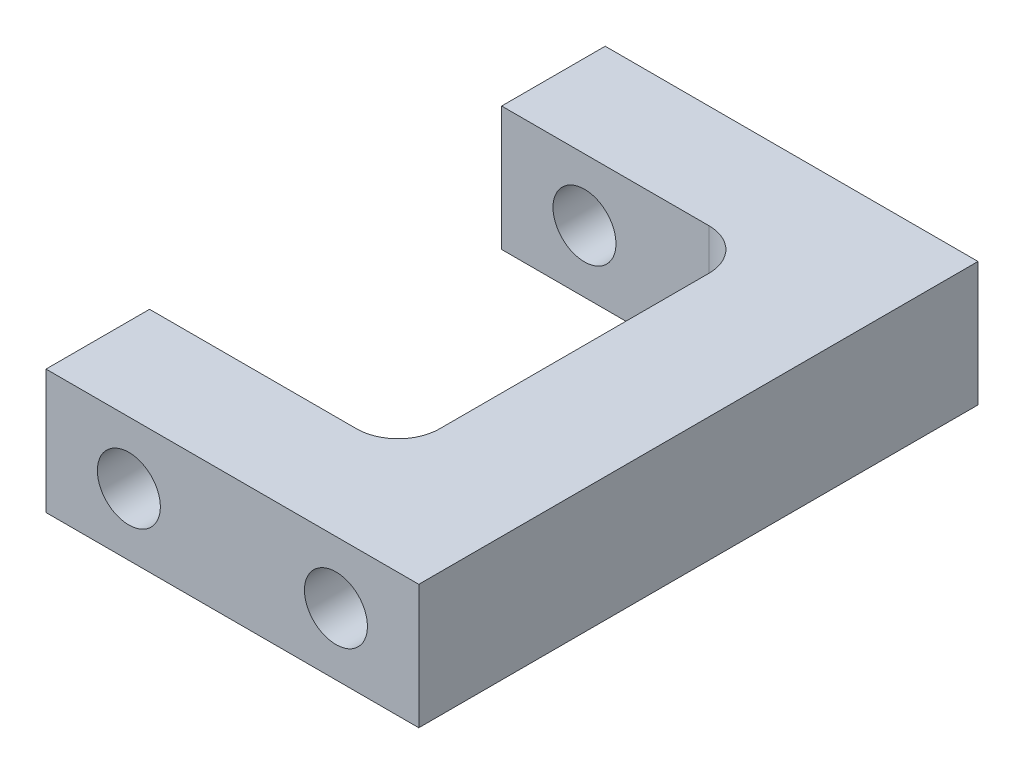
ISO-10303-21;
HEADER;
FILE_DESCRIPTION(('STEP AP214'),'2;1');
FILE_NAME('part.step','',(''),(''),'','','');
FILE_SCHEMA(('AUTOMOTIVE_DESIGN { 1 0 10303 214 1 1 1 1 }'));
ENDSEC;
DATA;
#1=APPLICATION_CONTEXT('core data for automotive mechanical design processes');
#2=APPLICATION_PROTOCOL_DEFINITION('international standard','automotive_design',2000,#1);
#3=PRODUCT_CONTEXT('',#1,'mechanical');
#4=PRODUCT('Part','Part','',(#3));
#5=PRODUCT_RELATED_PRODUCT_CATEGORY('part','',(#4));
#6=PRODUCT_DEFINITION_FORMATION('','',#4);
#7=PRODUCT_DEFINITION_CONTEXT('part definition',#1,'design');
#8=PRODUCT_DEFINITION('design','',#6,#7);
#9=PRODUCT_DEFINITION_SHAPE('','',#8);
#10=(LENGTH_UNIT() NAMED_UNIT(*) SI_UNIT(.MILLI.,.METRE.));
#11=(NAMED_UNIT(*) PLANE_ANGLE_UNIT() SI_UNIT($,.RADIAN.));
#12=(NAMED_UNIT(*) SI_UNIT($,.STERADIAN.) SOLID_ANGLE_UNIT());
#13=UNCERTAINTY_MEASURE_WITH_UNIT(LENGTH_MEASURE(1.E-05),#10,'distance_accuracy_value','');
#14=(GEOMETRIC_REPRESENTATION_CONTEXT(3) GLOBAL_UNCERTAINTY_ASSIGNED_CONTEXT((#13)) GLOBAL_UNIT_ASSIGNED_CONTEXT((#10,
#11,#12)) REPRESENTATION_CONTEXT('',''));
#15=CARTESIAN_POINT('',(0.,0.,0.));
#16=DIRECTION('',(0.,0.,1.));
#17=DIRECTION('',(1.,0.,0.));
#18=AXIS2_PLACEMENT_3D('',#15,#16,#17);
#19=CARTESIAN_POINT('',(0.,0.,25.));
#20=DIRECTION('',(0.,0.,-1.));
#21=DIRECTION('',(-1.,0.,0.));
#22=AXIS2_PLACEMENT_3D('',#19,#20,#21);
#23=PLANE('',#22);
#24=CARTESIAN_POINT('',(-25.,0.,25.));
#25=DIRECTION('',(0.,0.,-1.));
#26=DIRECTION('',(-1.,0.,0.));
#27=AXIS2_PLACEMENT_3D('',#24,#25,#26);
#28=CIRCLE('',#27,7.6);
#29=CARTESIAN_POINT('',(-32.6,0.,25.));
#30=VERTEX_POINT('',#29);
#31=EDGE_CURVE('E136',#30,#30,#28,.T.);
#32=ORIENTED_EDGE('',*,*,#31,.T.);
#33=EDGE_LOOP('',(#32));
#34=FACE_BOUND('',#33,.T.);
#35=DIRECTION('',(1.,0.,0.));
#36=VECTOR('',#35,1.);
#37=CARTESIAN_POINT('',(45.,-15.,25.));
#38=LINE('',#37,#36);
#39=CARTESIAN_POINT('',(-45.,-15.,25.));
#40=VERTEX_POINT('',#39);
#41=CARTESIAN_POINT('',(5.00000000000001,-15.,25.));
#42=VERTEX_POINT('',#41);
#43=EDGE_CURVE('E120',#40,#42,#38,.T.);
#44=ORIENTED_EDGE('',*,*,#43,.T.);
#45=DIRECTION('',(0.,-1.,0.));
#46=VECTOR('',#45,1.);
#47=CARTESIAN_POINT('',(5.,15.,25.));
#48=LINE('',#47,#46);
#49=CARTESIAN_POINT('',(4.99999999999998,15.,25.));
#50=VERTEX_POINT('',#49);
#51=EDGE_CURVE('E54',#42,#50,#48,.F.);
#52=ORIENTED_EDGE('',*,*,#51,.T.);
#53=DIRECTION('',(-1.,0.,0.));
#54=VECTOR('',#53,1.);
#55=CARTESIAN_POINT('',(-45.,15.,25.));
#56=LINE('',#55,#54);
#57=CARTESIAN_POINT('',(-45.,15.,25.));
#58=VERTEX_POINT('',#57);
#59=EDGE_CURVE('E159',#50,#58,#56,.T.);
#60=ORIENTED_EDGE('',*,*,#59,.T.);
#61=DIRECTION('',(0.,-1.,0.));
#62=VECTOR('',#61,1.);
#63=CARTESIAN_POINT('',(-45.,-15.,25.));
#64=LINE('',#63,#62);
#65=EDGE_CURVE('E161',#58,#40,#64,.T.);
#66=ORIENTED_EDGE('',*,*,#65,.T.);
#67=EDGE_LOOP('',(#44,#52,#60,#66));
#68=FACE_BOUND('',#67,.T.);
#69=ADVANCED_FACE('F33',(#34,#68),#23,.F.);
#70=CARTESIAN_POINT('',(-45.,15.,25.));
#71=DIRECTION('',(0.,-1.,0.));
#72=DIRECTION('',(0.,0.,-1.));
#73=AXIS2_PLACEMENT_3D('',#70,#71,#72);
#74=PLANE('',#73);
#75=DIRECTION('',(-1.,0.,0.));
#76=VECTOR('',#75,1.);
#77=CARTESIAN_POINT('',(-45.,15.,0.));
#78=LINE('',#77,#76);
#79=CARTESIAN_POINT('',(45.,15.,0.));
#80=VERTEX_POINT('',#79);
#81=CARTESIAN_POINT('',(-45.,15.,0.));
#82=VERTEX_POINT('',#81);
#83=EDGE_CURVE('E158',#80,#82,#78,.T.);
#84=ORIENTED_EDGE('',*,*,#83,.T.);
#85=DIRECTION('',(0.,0.,-1.));
#86=VECTOR('',#85,1.);
#87=CARTESIAN_POINT('',(-45.,15.,25.));
#88=LINE('',#87,#86);
#89=EDGE_CURVE('E174',#58,#82,#88,.T.);
#90=ORIENTED_EDGE('',*,*,#89,.F.);
#91=ORIENTED_EDGE('',*,*,#59,.F.);
#92=CARTESIAN_POINT('',(5.,15.,35.));
#93=DIRECTION('',(0.,-1.,0.));
#94=DIRECTION('',(0.,0.,-1.));
#95=AXIS2_PLACEMENT_3D('',#92,#93,#94);
#96=CIRCLE('',#95,10.);
#97=CARTESIAN_POINT('',(15.,15.,35.));
#98=VERTEX_POINT('',#97);
#99=EDGE_CURVE('E11',#50,#98,#96,.T.);
#100=ORIENTED_EDGE('',*,*,#99,.T.);
#101=DIRECTION('',(0.,0.,1.));
#102=VECTOR('',#101,1.);
#103=CARTESIAN_POINT('',(15.,15.,0.));
#104=LINE('',#103,#102);
#105=CARTESIAN_POINT('',(15.,15.,100.));
#106=VERTEX_POINT('',#105);
#107=EDGE_CURVE('E153',#98,#106,#104,.T.);
#108=ORIENTED_EDGE('',*,*,#107,.T.);
#109=CARTESIAN_POINT('',(5.,15.,100.));
#110=DIRECTION('',(0.,-1.,0.));
#111=DIRECTION('',(0.,0.,-1.));
#112=AXIS2_PLACEMENT_3D('',#109,#110,#111);
#113=CIRCLE('',#112,10.);
#114=CARTESIAN_POINT('',(5.,15.,110.));
#115=VERTEX_POINT('',#114);
#116=EDGE_CURVE('E188',#106,#115,#113,.T.);
#117=ORIENTED_EDGE('',*,*,#116,.T.);
#118=DIRECTION('',(1.,0.,0.));
#119=VECTOR('',#118,1.);
#120=CARTESIAN_POINT('',(-84.0512483795333,15.,110.));
#121=LINE('',#120,#119);
#122=CARTESIAN_POINT('',(-45.,15.,110.));
#123=VERTEX_POINT('',#122);
#124=EDGE_CURVE('E131',#123,#115,#121,.T.);
#125=ORIENTED_EDGE('',*,*,#124,.F.);
#126=DIRECTION('',(0.,0.,-1.));
#127=VECTOR('',#126,1.);
#128=CARTESIAN_POINT('',(-45.,15.,110.));
#129=LINE('',#128,#127);
#130=CARTESIAN_POINT('',(-45.,15.,135.));
#131=VERTEX_POINT('',#130);
#132=EDGE_CURVE('E127',#131,#123,#129,.T.);
#133=ORIENTED_EDGE('',*,*,#132,.F.);
#134=DIRECTION('',(1.,0.,0.));
#135=VECTOR('',#134,1.);
#136=CARTESIAN_POINT('',(-84.0512483795333,15.,135.));
#137=LINE('',#136,#135);
#138=CARTESIAN_POINT('',(45.,15.,135.));
#139=VERTEX_POINT('',#138);
#140=EDGE_CURVE('E124',#131,#139,#137,.T.);
#141=ORIENTED_EDGE('',*,*,#140,.T.);
#142=DIRECTION('',(0.,0.,-1.));
#143=VECTOR('',#142,1.);
#144=CARTESIAN_POINT('',(45.,15.,25.));
#145=LINE('',#144,#143);
#146=EDGE_CURVE('E109',#139,#80,#145,.T.);
#147=ORIENTED_EDGE('',*,*,#146,.T.);
#148=EDGE_LOOP('',(#84,#90,#91,#100,#108,#117,#125,#133,#141,#147));
#149=FACE_BOUND('',#148,.T.);
#150=ADVANCED_FACE('F125',(#149),#74,.F.);
#151=CARTESIAN_POINT('',(-45.,-15.,25.));
#152=DIRECTION('',(1.,0.,0.));
#153=DIRECTION('',(0.,0.,-1.));
#154=AXIS2_PLACEMENT_3D('',#151,#152,#153);
#155=PLANE('',#154);
#156=DIRECTION('',(0.,-1.,0.));
#157=VECTOR('',#156,1.);
#158=CARTESIAN_POINT('',(-45.,-15.,0.));
#159=LINE('',#158,#157);
#160=CARTESIAN_POINT('',(-45.,-15.,0.));
#161=VERTEX_POINT('',#160);
#162=EDGE_CURVE('E165',#82,#161,#159,.T.);
#163=ORIENTED_EDGE('',*,*,#162,.T.);
#164=DIRECTION('',(0.,0.,-1.));
#165=VECTOR('',#164,1.);
#166=CARTESIAN_POINT('',(-45.,-15.,25.));
#167=LINE('',#166,#165);
#168=EDGE_CURVE('E171',#40,#161,#167,.T.);
#169=ORIENTED_EDGE('',*,*,#168,.F.);
#170=ORIENTED_EDGE('',*,*,#65,.F.);
#171=ORIENTED_EDGE('',*,*,#89,.T.);
#172=EDGE_LOOP('',(#163,#169,#170,#171));
#173=FACE_BOUND('',#172,.T.);
#174=ADVANCED_FACE('F211',(#173),#155,.F.);
#175=CARTESIAN_POINT('',(45.,-15.,25.));
#176=DIRECTION('',(0.,1.,0.));
#177=DIRECTION('',(0.,0.,1.));
#178=AXIS2_PLACEMENT_3D('',#175,#176,#177);
#179=PLANE('',#178);
#180=DIRECTION('',(0.,0.,-1.));
#181=VECTOR('',#180,1.);
#182=CARTESIAN_POINT('',(45.,-15.,25.));
#183=LINE('',#182,#181);
#184=CARTESIAN_POINT('',(45.,-15.,135.));
#185=VERTEX_POINT('',#184);
#186=CARTESIAN_POINT('',(45.,-15.,0.));
#187=VERTEX_POINT('',#186);
#188=EDGE_CURVE('E119',#185,#187,#183,.T.);
#189=ORIENTED_EDGE('',*,*,#188,.F.);
#190=DIRECTION('',(1.,0.,0.));
#191=VECTOR('',#190,1.);
#192=CARTESIAN_POINT('',(-84.0512483795333,-15.,135.));
#193=LINE('',#192,#191);
#194=CARTESIAN_POINT('',(-45.,-15.,135.));
#195=VERTEX_POINT('',#194);
#196=EDGE_CURVE('E130',#195,#185,#193,.T.);
#197=ORIENTED_EDGE('',*,*,#196,.F.);
#198=DIRECTION('',(0.,0.,1.));
#199=VECTOR('',#198,1.);
#200=CARTESIAN_POINT('',(-45.,-15.,110.));
#201=LINE('',#200,#199);
#202=CARTESIAN_POINT('',(-45.,-15.,110.));
#203=VERTEX_POINT('',#202);
#204=EDGE_CURVE('E275',#203,#195,#201,.T.);
#205=ORIENTED_EDGE('',*,*,#204,.F.);
#206=DIRECTION('',(1.,0.,0.));
#207=VECTOR('',#206,1.);
#208=CARTESIAN_POINT('',(-84.0512483795333,-15.,110.));
#209=LINE('',#208,#207);
#210=CARTESIAN_POINT('',(5.,-15.,110.));
#211=VERTEX_POINT('',#210);
#212=EDGE_CURVE('E147',#203,#211,#209,.T.);
#213=ORIENTED_EDGE('',*,*,#212,.T.);
#214=CARTESIAN_POINT('',(5.,-15.,100.));
#215=DIRECTION('',(0.,1.,0.));
#216=DIRECTION('',(0.,0.,1.));
#217=AXIS2_PLACEMENT_3D('',#214,#215,#216);
#218=CIRCLE('',#217,10.);
#219=CARTESIAN_POINT('',(15.,-15.,100.));
#220=VERTEX_POINT('',#219);
#221=EDGE_CURVE('E186',#211,#220,#218,.T.);
#222=ORIENTED_EDGE('',*,*,#221,.T.);
#223=DIRECTION('',(0.,0.,-1.));
#224=VECTOR('',#223,1.);
#225=CARTESIAN_POINT('',(15.,-15.,0.));
#226=LINE('',#225,#224);
#227=CARTESIAN_POINT('',(15.,-15.,35.));
#228=VERTEX_POINT('',#227);
#229=EDGE_CURVE('E156',#220,#228,#226,.T.);
#230=ORIENTED_EDGE('',*,*,#229,.T.);
#231=CARTESIAN_POINT('',(5.,-15.,35.));
#232=DIRECTION('',(0.,1.,0.));
#233=DIRECTION('',(0.,0.,1.));
#234=AXIS2_PLACEMENT_3D('',#231,#232,#233);
#235=CIRCLE('',#234,10.);
#236=EDGE_CURVE('E41',#228,#42,#235,.T.);
#237=ORIENTED_EDGE('',*,*,#236,.T.);
#238=ORIENTED_EDGE('',*,*,#43,.F.);
#239=ORIENTED_EDGE('',*,*,#168,.T.);
#240=DIRECTION('',(1.,0.,0.));
#241=VECTOR('',#240,1.);
#242=CARTESIAN_POINT('',(45.,-15.,0.));
#243=LINE('',#242,#241);
#244=EDGE_CURVE('E167',#161,#187,#243,.T.);
#245=ORIENTED_EDGE('',*,*,#244,.T.);
#246=EDGE_LOOP('',(#189,#197,#205,#213,#222,#230,#237,#238,#239,#245));
#247=FACE_BOUND('',#246,.T.);
#248=ADVANCED_FACE('F200',(#247),#179,.F.);
#249=CARTESIAN_POINT('',(45.,15.,25.));
#250=DIRECTION('',(-1.,0.,0.));
#251=DIRECTION('',(0.,0.,1.));
#252=AXIS2_PLACEMENT_3D('',#249,#250,#251);
#253=PLANE('',#252);
#254=DIRECTION('',(0.,1.,0.));
#255=VECTOR('',#254,1.);
#256=CARTESIAN_POINT('',(45.,15.,0.));
#257=LINE('',#256,#255);
#258=EDGE_CURVE('E116',#187,#80,#257,.T.);
#259=ORIENTED_EDGE('',*,*,#258,.T.);
#260=ORIENTED_EDGE('',*,*,#146,.F.);
#261=DIRECTION('',(0.,-1.,0.));
#262=VECTOR('',#261,1.);
#263=CARTESIAN_POINT('',(45.,-15.,135.));
#264=LINE('',#263,#262);
#265=EDGE_CURVE('E114',#139,#185,#264,.T.);
#266=ORIENTED_EDGE('',*,*,#265,.T.);
#267=ORIENTED_EDGE('',*,*,#188,.T.);
#268=EDGE_LOOP('',(#259,#260,#266,#267));
#269=FACE_BOUND('',#268,.T.);
#270=ADVANCED_FACE('F111',(#269),#253,.F.);
#271=CARTESIAN_POINT('',(0.,0.,0.));
#272=DIRECTION('',(0.,0.,-1.));
#273=DIRECTION('',(-1.,0.,0.));
#274=AXIS2_PLACEMENT_3D('',#271,#272,#273);
#275=PLANE('',#274);
#276=CARTESIAN_POINT('',(25.,0.,0.));
#277=DIRECTION('',(0.,0.,-1.));
#278=DIRECTION('',(-1.,0.,0.));
#279=AXIS2_PLACEMENT_3D('',#276,#277,#278);
#280=CIRCLE('',#279,7.6);
#281=CARTESIAN_POINT('',(17.4,0.,0.));
#282=VERTEX_POINT('',#281);
#283=EDGE_CURVE('E263',#282,#282,#280,.T.);
#284=ORIENTED_EDGE('',*,*,#283,.F.);
#285=EDGE_LOOP('',(#284));
#286=FACE_BOUND('',#285,.T.);
#287=CARTESIAN_POINT('',(-25.,0.,0.));
#288=DIRECTION('',(0.,0.,-1.));
#289=DIRECTION('',(-1.,0.,0.));
#290=AXIS2_PLACEMENT_3D('',#287,#288,#289);
#291=CIRCLE('',#290,7.6);
#292=CARTESIAN_POINT('',(-32.6,0.,0.));
#293=VERTEX_POINT('',#292);
#294=EDGE_CURVE('E265',#293,#293,#291,.T.);
#295=ORIENTED_EDGE('',*,*,#294,.F.);
#296=EDGE_LOOP('',(#295));
#297=FACE_BOUND('',#296,.T.);
#298=ORIENTED_EDGE('',*,*,#258,.F.);
#299=ORIENTED_EDGE('',*,*,#244,.F.);
#300=ORIENTED_EDGE('',*,*,#162,.F.);
#301=ORIENTED_EDGE('',*,*,#83,.F.);
#302=EDGE_LOOP('',(#298,#299,#300,#301));
#303=FACE_BOUND('',#302,.T.);
#304=ADVANCED_FACE('F215',(#286,#297,#303),#275,.T.);
#305=CARTESIAN_POINT('',(15.,0.,0.));
#306=DIRECTION('',(1.,0.,0.));
#307=DIRECTION('',(0.,0.,-1.));
#308=AXIS2_PLACEMENT_3D('',#305,#306,#307);
#309=PLANE('',#308);
#310=ORIENTED_EDGE('',*,*,#229,.F.);
#311=DIRECTION('',(0.,-1.,0.));
#312=VECTOR('',#311,1.);
#313=CARTESIAN_POINT('',(15.,0.,100.));
#314=LINE('',#313,#312);
#315=EDGE_CURVE('E183',#220,#106,#314,.F.);
#316=ORIENTED_EDGE('',*,*,#315,.T.);
#317=ORIENTED_EDGE('',*,*,#107,.F.);
#318=DIRECTION('',(0.,-1.,0.));
#319=VECTOR('',#318,1.);
#320=CARTESIAN_POINT('',(15.,-15.,35.));
#321=LINE('',#320,#319);
#322=EDGE_CURVE('E180',#98,#228,#321,.T.);
#323=ORIENTED_EDGE('',*,*,#322,.T.);
#324=EDGE_LOOP('',(#310,#316,#317,#323));
#325=FACE_BOUND('',#324,.T.);
#326=ADVANCED_FACE('F203',(#325),#309,.F.);
#327=CARTESIAN_POINT('',(-84.0512483795333,-15.,110.));
#328=DIRECTION('',(0.,0.,-1.));
#329=DIRECTION('',(-1.,0.,0.));
#330=AXIS2_PLACEMENT_3D('',#327,#328,#329);
#331=PLANE('',#330);
#332=CARTESIAN_POINT('',(-25.,0.,110.));
#333=DIRECTION('',(0.,0.,-1.));
#334=DIRECTION('',(-1.,0.,0.));
#335=AXIS2_PLACEMENT_3D('',#332,#333,#334);
#336=CIRCLE('',#335,7.6);
#337=CARTESIAN_POINT('',(-32.6,0.,110.));
#338=VERTEX_POINT('',#337);
#339=EDGE_CURVE('E141',#338,#338,#336,.T.);
#340=ORIENTED_EDGE('',*,*,#339,.F.);
#341=EDGE_LOOP('',(#340));
#342=FACE_BOUND('',#341,.T.);
#343=ORIENTED_EDGE('',*,*,#124,.T.);
#344=DIRECTION('',(0.,-1.,0.));
#345=VECTOR('',#344,1.);
#346=CARTESIAN_POINT('',(5.,-15.,110.));
#347=LINE('',#346,#345);
#348=EDGE_CURVE('E177',#115,#211,#347,.T.);
#349=ORIENTED_EDGE('',*,*,#348,.T.);
#350=ORIENTED_EDGE('',*,*,#212,.F.);
#351=DIRECTION('',(0.,-1.,0.));
#352=VECTOR('',#351,1.);
#353=CARTESIAN_POINT('',(-45.,-15.,110.));
#354=LINE('',#353,#352);
#355=EDGE_CURVE('E145',#123,#203,#354,.T.);
#356=ORIENTED_EDGE('',*,*,#355,.F.);
#357=EDGE_LOOP('',(#343,#349,#350,#356));
#358=FACE_BOUND('',#357,.T.);
#359=ADVANCED_FACE('F196',(#342,#358),#331,.T.);
#360=CARTESIAN_POINT('',(-84.0512483795333,-15.,135.));
#361=DIRECTION('',(0.,0.,1.));
#362=DIRECTION('',(1.,0.,0.));
#363=AXIS2_PLACEMENT_3D('',#360,#361,#362);
#364=PLANE('',#363);
#365=CARTESIAN_POINT('',(25.,0.,135.));
#366=DIRECTION('',(0.,0.,-1.));
#367=DIRECTION('',(-1.,0.,0.));
#368=AXIS2_PLACEMENT_3D('',#365,#366,#367);
#369=CIRCLE('',#368,7.6);
#370=CARTESIAN_POINT('',(17.4,0.,135.));
#371=VERTEX_POINT('',#370);
#372=EDGE_CURVE('E261',#371,#371,#369,.T.);
#373=ORIENTED_EDGE('',*,*,#372,.T.);
#374=EDGE_LOOP('',(#373));
#375=FACE_BOUND('',#374,.T.);
#376=CARTESIAN_POINT('',(-25.,0.,135.));
#377=DIRECTION('',(0.,0.,-1.));
#378=DIRECTION('',(-1.,0.,0.));
#379=AXIS2_PLACEMENT_3D('',#376,#377,#378);
#380=CIRCLE('',#379,7.6);
#381=CARTESIAN_POINT('',(-32.6,0.,135.));
#382=VERTEX_POINT('',#381);
#383=EDGE_CURVE('E268',#382,#382,#380,.T.);
#384=ORIENTED_EDGE('',*,*,#383,.T.);
#385=EDGE_LOOP('',(#384));
#386=FACE_BOUND('',#385,.T.);
#387=DIRECTION('',(0.,1.,0.));
#388=VECTOR('',#387,1.);
#389=CARTESIAN_POINT('',(-45.,-15.,135.));
#390=LINE('',#389,#388);
#391=EDGE_CURVE('E150',#195,#131,#390,.T.);
#392=ORIENTED_EDGE('',*,*,#391,.F.);
#393=ORIENTED_EDGE('',*,*,#196,.T.);
#394=ORIENTED_EDGE('',*,*,#265,.F.);
#395=ORIENTED_EDGE('',*,*,#140,.F.);
#396=EDGE_LOOP('',(#392,#393,#394,#395));
#397=FACE_BOUND('',#396,.T.);
#398=ADVANCED_FACE('F134',(#375,#386,#397),#364,.T.);
#399=CARTESIAN_POINT('',(-45.,-15.,25.));
#400=DIRECTION('',(1.,0.,0.));
#401=DIRECTION('',(0.,0.,-1.));
#402=AXIS2_PLACEMENT_3D('',#399,#400,#401);
#403=PLANE('',#402);
#404=ORIENTED_EDGE('',*,*,#355,.T.);
#405=ORIENTED_EDGE('',*,*,#204,.T.);
#406=ORIENTED_EDGE('',*,*,#391,.T.);
#407=ORIENTED_EDGE('',*,*,#132,.T.);
#408=EDGE_LOOP('',(#404,#405,#406,#407));
#409=FACE_BOUND('',#408,.T.);
#410=ADVANCED_FACE('F240',(#409),#403,.F.);
#411=CARTESIAN_POINT('',(-25.,0.,135.));
#412=DIRECTION('',(0.,0.,-1.));
#413=DIRECTION('',(-1.,0.,0.));
#414=AXIS2_PLACEMENT_3D('',#411,#412,#413);
#415=CYLINDRICAL_SURFACE('',#414,7.6);
#416=ORIENTED_EDGE('',*,*,#339,.T.);
#417=EDGE_LOOP('',(#416));
#418=FACE_BOUND('',#417,.T.);
#419=ORIENTED_EDGE('',*,*,#383,.F.);
#420=EDGE_LOOP('',(#419));
#421=FACE_BOUND('',#420,.T.);
#422=ADVANCED_FACE('F244',(#418,#421),#415,.F.);
#423=ORIENTED_EDGE('',*,*,#294,.T.);
#424=EDGE_LOOP('',(#423));
#425=FACE_BOUND('',#424,.T.);
#426=ORIENTED_EDGE('',*,*,#31,.F.);
#427=EDGE_LOOP('',(#426));
#428=FACE_BOUND('',#427,.T.);
#429=ADVANCED_FACE('F248',(#425,#428),#415,.F.);
#430=CARTESIAN_POINT('',(25.,0.,135.));
#431=DIRECTION('',(0.,0.,-1.));
#432=DIRECTION('',(-1.,0.,0.));
#433=AXIS2_PLACEMENT_3D('',#430,#431,#432);
#434=CYLINDRICAL_SURFACE('',#433,7.6);
#435=ORIENTED_EDGE('',*,*,#372,.F.);
#436=EDGE_LOOP('',(#435));
#437=FACE_BOUND('',#436,.T.);
#438=ORIENTED_EDGE('',*,*,#283,.T.);
#439=EDGE_LOOP('',(#438));
#440=FACE_BOUND('',#439,.T.);
#441=ADVANCED_FACE('F250',(#437,#440),#434,.F.);
#442=CARTESIAN_POINT('',(5.,-15.,100.));
#443=DIRECTION('',(0.,-1.,0.));
#444=DIRECTION('',(0.,0.,-1.));
#445=AXIS2_PLACEMENT_3D('',#442,#443,#444);
#446=CYLINDRICAL_SURFACE('',#445,10.);
#447=ORIENTED_EDGE('',*,*,#116,.F.);
#448=ORIENTED_EDGE('',*,*,#315,.F.);
#449=ORIENTED_EDGE('',*,*,#221,.F.);
#450=ORIENTED_EDGE('',*,*,#348,.F.);
#451=EDGE_LOOP('',(#447,#448,#449,#450));
#452=FACE_BOUND('',#451,.T.);
#453=ADVANCED_FACE('F198',(#452),#446,.F.);
#454=CARTESIAN_POINT('',(5.,0.,35.));
#455=DIRECTION('',(0.,1.,0.));
#456=DIRECTION('',(0.,0.,1.));
#457=AXIS2_PLACEMENT_3D('',#454,#455,#456);
#458=CYLINDRICAL_SURFACE('',#457,10.);
#459=ORIENTED_EDGE('',*,*,#99,.F.);
#460=ORIENTED_EDGE('',*,*,#51,.F.);
#461=ORIENTED_EDGE('',*,*,#236,.F.);
#462=ORIENTED_EDGE('',*,*,#322,.F.);
#463=EDGE_LOOP('',(#459,#460,#461,#462));
#464=FACE_BOUND('',#463,.T.);
#465=ADVANCED_FACE('F35',(#464),#458,.F.);
#466=CLOSED_SHELL('',(#69,#150,#174,#248,#270,#304,#326,#359,#398,#410,#422,#429,#441,#453,#465));
#467=MANIFOLD_SOLID_BREP('B2',#466);
#468=ADVANCED_BREP_SHAPE_REPRESENTATION('',(#18,#467),#14);
#469=SHAPE_DEFINITION_REPRESENTATION(#9,#468);
ENDSEC;
END-ISO-10303-21;
